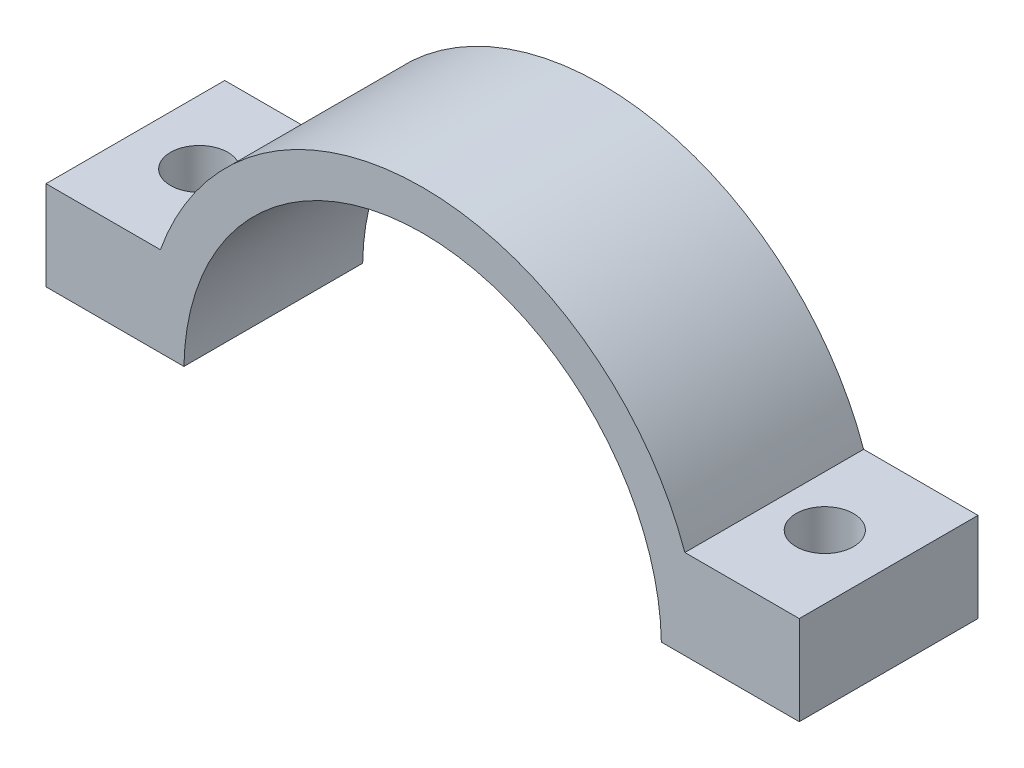
ISO-10303-21;
HEADER;
FILE_DESCRIPTION(('STEP AP214'),'2;1');
FILE_NAME('part.step','',(''),(''),'','','');
FILE_SCHEMA(('AUTOMOTIVE_DESIGN { 1 0 10303 214 1 1 1 1 }'));
ENDSEC;
DATA;
#1=APPLICATION_CONTEXT('core data for automotive mechanical design processes');
#2=APPLICATION_PROTOCOL_DEFINITION('international standard','automotive_design',2000,#1);
#3=PRODUCT_CONTEXT('',#1,'mechanical');
#4=PRODUCT('Part','Part','',(#3));
#5=PRODUCT_RELATED_PRODUCT_CATEGORY('part','',(#4));
#6=PRODUCT_DEFINITION_FORMATION('','',#4);
#7=PRODUCT_DEFINITION_CONTEXT('part definition',#1,'design');
#8=PRODUCT_DEFINITION('design','',#6,#7);
#9=PRODUCT_DEFINITION_SHAPE('','',#8);
#10=(LENGTH_UNIT() NAMED_UNIT(*) SI_UNIT(.MILLI.,.METRE.));
#11=(NAMED_UNIT(*) PLANE_ANGLE_UNIT() SI_UNIT($,.RADIAN.));
#12=(NAMED_UNIT(*) SI_UNIT($,.STERADIAN.) SOLID_ANGLE_UNIT());
#13=UNCERTAINTY_MEASURE_WITH_UNIT(LENGTH_MEASURE(1.E-05),#10,'distance_accuracy_value','');
#14=(GEOMETRIC_REPRESENTATION_CONTEXT(3) GLOBAL_UNCERTAINTY_ASSIGNED_CONTEXT((#13)) GLOBAL_UNIT_ASSIGNED_CONTEXT((#10,
#11,#12)) REPRESENTATION_CONTEXT('',''));
#15=CARTESIAN_POINT('',(0.,0.,0.));
#16=DIRECTION('',(0.,0.,1.));
#17=DIRECTION('',(1.,0.,0.));
#18=AXIS2_PLACEMENT_3D('',#15,#16,#17);
#19=CARTESIAN_POINT('',(0.,28.500000000234,14.));
#20=DIRECTION('',(0.,0.,-1.));
#21=DIRECTION('',(-1.,0.,0.));
#22=AXIS2_PLACEMENT_3D('',#19,#20,#21);
#23=CYLINDRICAL_SURFACE('',#22,21.799999999766);
#24=CARTESIAN_POINT('',(0.,28.500000000234,0.));
#25=DIRECTION('',(0.,0.,1.));
#26=DIRECTION('',(-1.,0.,0.));
#27=AXIS2_PLACEMENT_3D('',#24,#25,#26);
#28=CIRCLE('',#27,21.799999999766);
#29=CARTESIAN_POINT('',(20.541421567,35.8,0.));
#30=VERTEX_POINT('',#29);
#31=CARTESIAN_POINT('',(-20.541421567,35.8,0.));
#32=VERTEX_POINT('',#31);
#33=EDGE_CURVE('E150',#30,#32,#28,.T.);
#34=ORIENTED_EDGE('',*,*,#33,.T.);
#35=DIRECTION('',(0.,0.,-1.));
#36=VECTOR('',#35,1.);
#37=CARTESIAN_POINT('',(-20.541421567,35.8,14.));
#38=LINE('',#37,#36);
#39=CARTESIAN_POINT('',(-20.541421567,35.8,14.));
#40=VERTEX_POINT('',#39);
#41=EDGE_CURVE('E11',#40,#32,#38,.T.);
#42=ORIENTED_EDGE('',*,*,#41,.F.);
#43=CARTESIAN_POINT('',(0.,28.500000000234,14.));
#44=DIRECTION('',(0.,0.,1.));
#45=DIRECTION('',(-1.,0.,0.));
#46=AXIS2_PLACEMENT_3D('',#43,#44,#45);
#47=CIRCLE('',#46,21.799999999766);
#48=CARTESIAN_POINT('',(20.541421567,35.8,14.));
#49=VERTEX_POINT('',#48);
#50=EDGE_CURVE('E173',#49,#40,#47,.T.);
#51=ORIENTED_EDGE('',*,*,#50,.F.);
#52=DIRECTION('',(0.,0.,-1.));
#53=VECTOR('',#52,1.);
#54=CARTESIAN_POINT('',(20.541421567,35.8,14.));
#55=LINE('',#54,#53);
#56=EDGE_CURVE('E146',#49,#30,#55,.T.);
#57=ORIENTED_EDGE('',*,*,#56,.T.);
#58=EDGE_LOOP('',(#34,#42,#51,#57));
#59=FACE_BOUND('',#58,.T.);
#60=ADVANCED_FACE('F45',(#59),#23,.T.);
#61=CARTESIAN_POINT('',(-29.5,35.8,14.));
#62=DIRECTION('',(0.,-1.,0.));
#63=DIRECTION('',(0.,0.,-1.));
#64=AXIS2_PLACEMENT_3D('',#61,#62,#63);
#65=PLANE('',#64);
#66=CARTESIAN_POINT('',(-24.5,35.8,7.));
#67=DIRECTION('',(0.,-1.,0.));
#68=DIRECTION('',(0.,0.,-1.));
#69=AXIS2_PLACEMENT_3D('',#66,#67,#68);
#70=CIRCLE('',#69,2.25);
#71=CARTESIAN_POINT('',(-24.5,35.8,4.75));
#72=VERTEX_POINT('',#71);
#73=EDGE_CURVE('E155',#72,#72,#70,.F.);
#74=ORIENTED_EDGE('',*,*,#73,.F.);
#75=EDGE_LOOP('',(#74));
#76=FACE_BOUND('',#75,.T.);
#77=DIRECTION('',(-1.,0.,0.));
#78=VECTOR('',#77,1.);
#79=CARTESIAN_POINT('',(-29.5,35.8,0.));
#80=LINE('',#79,#78);
#81=CARTESIAN_POINT('',(-29.5,35.8,0.));
#82=VERTEX_POINT('',#81);
#83=EDGE_CURVE('E154',#32,#82,#80,.T.);
#84=ORIENTED_EDGE('',*,*,#83,.T.);
#85=DIRECTION('',(0.,0.,-1.));
#86=VECTOR('',#85,1.);
#87=CARTESIAN_POINT('',(-29.5,35.8,14.));
#88=LINE('',#87,#86);
#89=CARTESIAN_POINT('',(-29.5,35.8,14.));
#90=VERTEX_POINT('',#89);
#91=EDGE_CURVE('E55',#90,#82,#88,.T.);
#92=ORIENTED_EDGE('',*,*,#91,.F.);
#93=DIRECTION('',(-1.,0.,0.));
#94=VECTOR('',#93,1.);
#95=CARTESIAN_POINT('',(-29.5,35.8,14.));
#96=LINE('',#95,#94);
#97=EDGE_CURVE('E107',#40,#90,#96,.T.);
#98=ORIENTED_EDGE('',*,*,#97,.F.);
#99=ORIENTED_EDGE('',*,*,#41,.T.);
#100=EDGE_LOOP('',(#84,#92,#98,#99));
#101=FACE_BOUND('',#100,.T.);
#102=ADVANCED_FACE('F243',(#76,#101),#65,.F.);
#103=CARTESIAN_POINT('',(-29.5,28.8,14.));
#104=DIRECTION('',(1.,0.,0.));
#105=DIRECTION('',(0.,0.,-1.));
#106=AXIS2_PLACEMENT_3D('',#103,#104,#105);
#107=PLANE('',#106);
#108=DIRECTION('',(0.,-1.,0.));
#109=VECTOR('',#108,1.);
#110=CARTESIAN_POINT('',(-29.5,28.8,0.));
#111=LINE('',#110,#109);
#112=CARTESIAN_POINT('',(-29.5,28.8,0.));
#113=VERTEX_POINT('',#112);
#114=EDGE_CURVE('E158',#82,#113,#111,.T.);
#115=ORIENTED_EDGE('',*,*,#114,.T.);
#116=DIRECTION('',(0.,0.,-1.));
#117=VECTOR('',#116,1.);
#118=CARTESIAN_POINT('',(-29.5,28.8,14.));
#119=LINE('',#118,#117);
#120=CARTESIAN_POINT('',(-29.5,28.8,14.));
#121=VERTEX_POINT('',#120);
#122=EDGE_CURVE('E183',#121,#113,#119,.T.);
#123=ORIENTED_EDGE('',*,*,#122,.F.);
#124=DIRECTION('',(0.,-1.,0.));
#125=VECTOR('',#124,1.);
#126=CARTESIAN_POINT('',(-29.5,28.8,14.));
#127=LINE('',#126,#125);
#128=EDGE_CURVE('E211',#90,#121,#127,.T.);
#129=ORIENTED_EDGE('',*,*,#128,.F.);
#130=ORIENTED_EDGE('',*,*,#91,.T.);
#131=EDGE_LOOP('',(#115,#123,#129,#130));
#132=FACE_BOUND('',#131,.T.);
#133=ADVANCED_FACE('F246',(#132),#107,.F.);
#134=CARTESIAN_POINT('',(-18.697593428,28.8,14.));
#135=DIRECTION('',(0.,1.,0.));
#136=DIRECTION('',(0.,0.,1.));
#137=AXIS2_PLACEMENT_3D('',#134,#135,#136);
#138=PLANE('',#137);
#139=CARTESIAN_POINT('',(-24.5,28.8,7.));
#140=DIRECTION('',(0.,1.,0.));
#141=DIRECTION('',(0.,0.,1.));
#142=AXIS2_PLACEMENT_3D('',#139,#140,#141);
#143=CIRCLE('',#142,2.25);
#144=CARTESIAN_POINT('',(-24.5,28.8,9.25));
#145=VERTEX_POINT('',#144);
#146=EDGE_CURVE('E48',#145,#145,#143,.F.);
#147=ORIENTED_EDGE('',*,*,#146,.F.);
#148=EDGE_LOOP('',(#147));
#149=FACE_BOUND('',#148,.T.);
#150=DIRECTION('',(1.,0.,0.));
#151=VECTOR('',#150,1.);
#152=CARTESIAN_POINT('',(-18.697593428,28.8,0.));
#153=LINE('',#152,#151);
#154=CARTESIAN_POINT('',(-18.697593428,28.8,0.));
#155=VERTEX_POINT('',#154);
#156=EDGE_CURVE('E161',#113,#155,#153,.T.);
#157=ORIENTED_EDGE('',*,*,#156,.T.);
#158=DIRECTION('',(0.,0.,-1.));
#159=VECTOR('',#158,1.);
#160=CARTESIAN_POINT('',(-18.697593428,28.8,14.));
#161=LINE('',#160,#159);
#162=CARTESIAN_POINT('',(-18.697593428,28.8,14.));
#163=VERTEX_POINT('',#162);
#164=EDGE_CURVE('E180',#163,#155,#161,.T.);
#165=ORIENTED_EDGE('',*,*,#164,.F.);
#166=DIRECTION('',(1.,0.,0.));
#167=VECTOR('',#166,1.);
#168=CARTESIAN_POINT('',(-18.697593428,28.8,14.));
#169=LINE('',#168,#167);
#170=EDGE_CURVE('E213',#121,#163,#169,.T.);
#171=ORIENTED_EDGE('',*,*,#170,.F.);
#172=ORIENTED_EDGE('',*,*,#122,.T.);
#173=EDGE_LOOP('',(#157,#165,#171,#172));
#174=FACE_BOUND('',#173,.T.);
#175=ADVANCED_FACE('F220',(#149,#174),#138,.F.);
#176=CARTESIAN_POINT('',(0.,28.500000000234,14.));
#177=DIRECTION('',(0.,0.,-1.));
#178=DIRECTION('',(-1.,0.,0.));
#179=AXIS2_PLACEMENT_3D('',#176,#177,#178);
#180=CYLINDRICAL_SURFACE('',#179,18.6999999999639);
#181=CARTESIAN_POINT('',(0.,28.500000000234,0.));
#182=DIRECTION('',(0.,0.,-1.));
#183=DIRECTION('',(1.,0.,0.));
#184=AXIS2_PLACEMENT_3D('',#181,#182,#183);
#185=CIRCLE('',#184,18.6999999999639);
#186=CARTESIAN_POINT('',(18.697593428,28.8,0.));
#187=VERTEX_POINT('',#186);
#188=EDGE_CURVE('E164',#155,#187,#185,.T.);
#189=ORIENTED_EDGE('',*,*,#188,.T.);
#190=DIRECTION('',(0.,0.,-1.));
#191=VECTOR('',#190,1.);
#192=CARTESIAN_POINT('',(18.697593428,28.8,14.));
#193=LINE('',#192,#191);
#194=CARTESIAN_POINT('',(18.697593428,28.8,14.));
#195=VERTEX_POINT('',#194);
#196=EDGE_CURVE('E137',#195,#187,#193,.T.);
#197=ORIENTED_EDGE('',*,*,#196,.F.);
#198=CARTESIAN_POINT('',(0.,28.500000000234,14.));
#199=DIRECTION('',(0.,0.,-1.));
#200=DIRECTION('',(1.,0.,0.));
#201=AXIS2_PLACEMENT_3D('',#198,#199,#200);
#202=CIRCLE('',#201,18.6999999999639);
#203=EDGE_CURVE('E126',#163,#195,#202,.T.);
#204=ORIENTED_EDGE('',*,*,#203,.F.);
#205=ORIENTED_EDGE('',*,*,#164,.T.);
#206=EDGE_LOOP('',(#189,#197,#204,#205));
#207=FACE_BOUND('',#206,.T.);
#208=ADVANCED_FACE('F224',(#207),#180,.F.);
#209=CARTESIAN_POINT('',(29.5,28.8,14.));
#210=DIRECTION('',(0.,1.,0.));
#211=DIRECTION('',(0.,0.,1.));
#212=AXIS2_PLACEMENT_3D('',#209,#210,#211);
#213=PLANE('',#212);
#214=CARTESIAN_POINT('',(24.5,28.8,7.));
#215=DIRECTION('',(0.,1.,0.));
#216=DIRECTION('',(0.,0.,1.));
#217=AXIS2_PLACEMENT_3D('',#214,#215,#216);
#218=CIRCLE('',#217,2.25);
#219=CARTESIAN_POINT('',(24.5,28.8,9.25));
#220=VERTEX_POINT('',#219);
#221=EDGE_CURVE('E192',#220,#220,#218,.F.);
#222=ORIENTED_EDGE('',*,*,#221,.F.);
#223=EDGE_LOOP('',(#222));
#224=FACE_BOUND('',#223,.T.);
#225=DIRECTION('',(1.,0.,0.));
#226=VECTOR('',#225,1.);
#227=CARTESIAN_POINT('',(29.5,28.8,0.));
#228=LINE('',#227,#226);
#229=CARTESIAN_POINT('',(29.5,28.8,0.));
#230=VERTEX_POINT('',#229);
#231=EDGE_CURVE('E135',#187,#230,#228,.T.);
#232=ORIENTED_EDGE('',*,*,#231,.T.);
#233=DIRECTION('',(0.,0.,-1.));
#234=VECTOR('',#233,1.);
#235=CARTESIAN_POINT('',(29.5,28.8,14.));
#236=LINE('',#235,#234);
#237=CARTESIAN_POINT('',(29.5,28.8,14.));
#238=VERTEX_POINT('',#237);
#239=EDGE_CURVE('E132',#238,#230,#236,.T.);
#240=ORIENTED_EDGE('',*,*,#239,.F.);
#241=DIRECTION('',(1.,0.,0.));
#242=VECTOR('',#241,1.);
#243=CARTESIAN_POINT('',(29.5,28.8,14.));
#244=LINE('',#243,#242);
#245=EDGE_CURVE('E120',#195,#238,#244,.T.);
#246=ORIENTED_EDGE('',*,*,#245,.F.);
#247=ORIENTED_EDGE('',*,*,#196,.T.);
#248=EDGE_LOOP('',(#232,#240,#246,#247));
#249=FACE_BOUND('',#248,.T.);
#250=ADVANCED_FACE('F133',(#224,#249),#213,.F.);
#251=CARTESIAN_POINT('',(29.5,35.8,14.));
#252=DIRECTION('',(-1.,0.,0.));
#253=DIRECTION('',(0.,0.,1.));
#254=AXIS2_PLACEMENT_3D('',#251,#252,#253);
#255=PLANE('',#254);
#256=DIRECTION('',(0.,1.,0.));
#257=VECTOR('',#256,1.);
#258=CARTESIAN_POINT('',(29.5,35.8,0.));
#259=LINE('',#258,#257);
#260=CARTESIAN_POINT('',(29.5,35.8,0.));
#261=VERTEX_POINT('',#260);
#262=EDGE_CURVE('E93',#230,#261,#259,.T.);
#263=ORIENTED_EDGE('',*,*,#262,.T.);
#264=DIRECTION('',(0.,0.,-1.));
#265=VECTOR('',#264,1.);
#266=CARTESIAN_POINT('',(29.5,35.8,14.));
#267=LINE('',#266,#265);
#268=CARTESIAN_POINT('',(29.5,35.8,14.));
#269=VERTEX_POINT('',#268);
#270=EDGE_CURVE('E138',#269,#261,#267,.T.);
#271=ORIENTED_EDGE('',*,*,#270,.F.);
#272=DIRECTION('',(0.,1.,0.));
#273=VECTOR('',#272,1.);
#274=CARTESIAN_POINT('',(29.5,35.8,14.));
#275=LINE('',#274,#273);
#276=EDGE_CURVE('E124',#238,#269,#275,.T.);
#277=ORIENTED_EDGE('',*,*,#276,.F.);
#278=ORIENTED_EDGE('',*,*,#239,.T.);
#279=EDGE_LOOP('',(#263,#271,#277,#278));
#280=FACE_BOUND('',#279,.T.);
#281=ADVANCED_FACE('F140',(#280),#255,.F.);
#282=CARTESIAN_POINT('',(20.541421567,35.8,14.));
#283=DIRECTION('',(0.,-1.,0.));
#284=DIRECTION('',(0.,0.,-1.));
#285=AXIS2_PLACEMENT_3D('',#282,#283,#284);
#286=PLANE('',#285);
#287=CARTESIAN_POINT('',(24.5,35.8,7.));
#288=DIRECTION('',(0.,-1.,0.));
#289=DIRECTION('',(0.,0.,-1.));
#290=AXIS2_PLACEMENT_3D('',#287,#288,#289);
#291=CIRCLE('',#290,2.25);
#292=CARTESIAN_POINT('',(24.5,35.8,4.75));
#293=VERTEX_POINT('',#292);
#294=EDGE_CURVE('E189',#293,#293,#291,.F.);
#295=ORIENTED_EDGE('',*,*,#294,.F.);
#296=EDGE_LOOP('',(#295));
#297=FACE_BOUND('',#296,.T.);
#298=DIRECTION('',(-1.,0.,0.));
#299=VECTOR('',#298,1.);
#300=CARTESIAN_POINT('',(20.541421567,35.8,0.));
#301=LINE('',#300,#299);
#302=EDGE_CURVE('E99',#261,#30,#301,.T.);
#303=ORIENTED_EDGE('',*,*,#302,.T.);
#304=ORIENTED_EDGE('',*,*,#56,.F.);
#305=DIRECTION('',(-1.,0.,0.));
#306=VECTOR('',#305,1.);
#307=CARTESIAN_POINT('',(20.541421567,35.8,14.));
#308=LINE('',#307,#306);
#309=EDGE_CURVE('E64',#269,#49,#308,.T.);
#310=ORIENTED_EDGE('',*,*,#309,.F.);
#311=ORIENTED_EDGE('',*,*,#270,.T.);
#312=EDGE_LOOP('',(#303,#304,#310,#311));
#313=FACE_BOUND('',#312,.T.);
#314=ADVANCED_FACE('F232',(#297,#313),#286,.F.);
#315=CARTESIAN_POINT('',(0.,28.500000000234,14.));
#316=DIRECTION('',(0.,0.,-1.));
#317=DIRECTION('',(-1.,0.,0.));
#318=AXIS2_PLACEMENT_3D('',#315,#316,#317);
#319=PLANE('',#318);
#320=ORIENTED_EDGE('',*,*,#50,.T.);
#321=ORIENTED_EDGE('',*,*,#97,.T.);
#322=ORIENTED_EDGE('',*,*,#128,.T.);
#323=ORIENTED_EDGE('',*,*,#170,.T.);
#324=ORIENTED_EDGE('',*,*,#203,.T.);
#325=ORIENTED_EDGE('',*,*,#245,.T.);
#326=ORIENTED_EDGE('',*,*,#276,.T.);
#327=ORIENTED_EDGE('',*,*,#309,.T.);
#328=EDGE_LOOP('',(#320,#321,#322,#323,#324,#325,#326,#327));
#329=FACE_BOUND('',#328,.T.);
#330=ADVANCED_FACE('F122',(#329),#319,.F.);
#331=CARTESIAN_POINT('',(0.,28.500000000234,0.));
#332=DIRECTION('',(0.,0.,-1.));
#333=DIRECTION('',(-1.,0.,0.));
#334=AXIS2_PLACEMENT_3D('',#331,#332,#333);
#335=PLANE('',#334);
#336=ORIENTED_EDGE('',*,*,#33,.F.);
#337=ORIENTED_EDGE('',*,*,#302,.F.);
#338=ORIENTED_EDGE('',*,*,#262,.F.);
#339=ORIENTED_EDGE('',*,*,#231,.F.);
#340=ORIENTED_EDGE('',*,*,#188,.F.);
#341=ORIENTED_EDGE('',*,*,#156,.F.);
#342=ORIENTED_EDGE('',*,*,#114,.F.);
#343=ORIENTED_EDGE('',*,*,#83,.F.);
#344=EDGE_LOOP('',(#336,#337,#338,#339,#340,#341,#342,#343));
#345=FACE_BOUND('',#344,.T.);
#346=ADVANCED_FACE('F227',(#345),#335,.T.);
#347=CARTESIAN_POINT('',(24.5,28.8,7.));
#348=DIRECTION('',(0.,-1.,0.));
#349=DIRECTION('',(0.,0.,-1.));
#350=AXIS2_PLACEMENT_3D('',#347,#348,#349);
#351=CYLINDRICAL_SURFACE('',#350,2.25);
#352=ORIENTED_EDGE('',*,*,#294,.T.);
#353=EDGE_LOOP('',(#352));
#354=FACE_BOUND('',#353,.T.);
#355=ORIENTED_EDGE('',*,*,#221,.T.);
#356=EDGE_LOOP('',(#355));
#357=FACE_BOUND('',#356,.T.);
#358=ADVANCED_FACE('F286',(#354,#357),#351,.F.);
#359=CARTESIAN_POINT('',(-24.5,28.8,7.));
#360=DIRECTION('',(0.,-1.,0.));
#361=DIRECTION('',(0.,0.,-1.));
#362=AXIS2_PLACEMENT_3D('',#359,#360,#361);
#363=CYLINDRICAL_SURFACE('',#362,2.25);
#364=ORIENTED_EDGE('',*,*,#146,.T.);
#365=EDGE_LOOP('',(#364));
#366=FACE_BOUND('',#365,.T.);
#367=ORIENTED_EDGE('',*,*,#73,.T.);
#368=EDGE_LOOP('',(#367));
#369=FACE_BOUND('',#368,.T.);
#370=ADVANCED_FACE('F334',(#366,#369),#363,.F.);
#371=CLOSED_SHELL('',(#60,#102,#133,#175,#208,#250,#281,#314,#330,#346,#358,#370));
#372=MANIFOLD_SOLID_BREP('B2',#371);
#373=ADVANCED_BREP_SHAPE_REPRESENTATION('',(#18,#372),#14);
#374=SHAPE_DEFINITION_REPRESENTATION(#9,#373);
ENDSEC;
END-ISO-10303-21;
